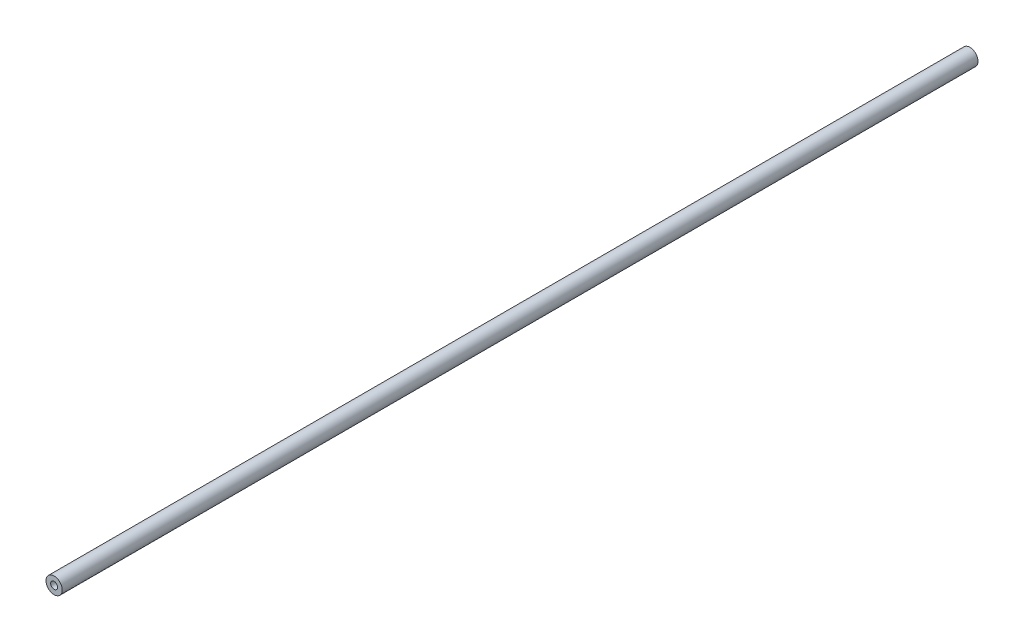
ISO-10303-21;
HEADER;
FILE_DESCRIPTION(('STEP AP214'),'2;1');
FILE_NAME('part.step','',(''),(''),'','','');
FILE_SCHEMA(('AUTOMOTIVE_DESIGN { 1 0 10303 214 1 1 1 1 }'));
ENDSEC;
DATA;
#1=APPLICATION_CONTEXT('core data for automotive mechanical design processes');
#2=APPLICATION_PROTOCOL_DEFINITION('international standard','automotive_design',2000,#1);
#3=PRODUCT_CONTEXT('',#1,'mechanical');
#4=PRODUCT('Part','Part','',(#3));
#5=PRODUCT_RELATED_PRODUCT_CATEGORY('part','',(#4));
#6=PRODUCT_DEFINITION_FORMATION('','',#4);
#7=PRODUCT_DEFINITION_CONTEXT('part definition',#1,'design');
#8=PRODUCT_DEFINITION('design','',#6,#7);
#9=PRODUCT_DEFINITION_SHAPE('','',#8);
#10=(LENGTH_UNIT() NAMED_UNIT(*) SI_UNIT(.MILLI.,.METRE.));
#11=(NAMED_UNIT(*) PLANE_ANGLE_UNIT() SI_UNIT($,.RADIAN.));
#12=(NAMED_UNIT(*) SI_UNIT($,.STERADIAN.) SOLID_ANGLE_UNIT());
#13=UNCERTAINTY_MEASURE_WITH_UNIT(LENGTH_MEASURE(1.E-05),#10,'distance_accuracy_value','');
#14=(GEOMETRIC_REPRESENTATION_CONTEXT(3) GLOBAL_UNCERTAINTY_ASSIGNED_CONTEXT((#13)) GLOBAL_UNIT_ASSIGNED_CONTEXT((#10,
#11,#12)) REPRESENTATION_CONTEXT('',''));
#15=CARTESIAN_POINT('',(0.,0.,0.));
#16=DIRECTION('',(0.,0.,1.));
#17=DIRECTION('',(1.,0.,0.));
#18=AXIS2_PLACEMENT_3D('',#15,#16,#17);
#19=CARTESIAN_POINT('',(0.,0.,268.2875));
#20=DIRECTION('',(0.,0.,-1.));
#21=DIRECTION('',(-1.,0.,0.));
#22=AXIS2_PLACEMENT_3D('',#19,#20,#21);
#23=CYLINDRICAL_SURFACE('',#22,4.7625);
#24=CARTESIAN_POINT('',(0.,0.,268.2875));
#25=DIRECTION('',(0.,0.,1.));
#26=DIRECTION('',(1.,0.,0.));
#27=AXIS2_PLACEMENT_3D('',#24,#25,#26);
#28=CIRCLE('',#27,4.7625);
#29=CARTESIAN_POINT('',(4.7625,0.,268.2875));
#30=VERTEX_POINT('',#29);
#31=EDGE_CURVE('E11',#30,#30,#28,.T.);
#32=ORIENTED_EDGE('',*,*,#31,.F.);
#33=EDGE_LOOP('',(#32));
#34=FACE_BOUND('',#33,.T.);
#35=CARTESIAN_POINT('',(0.,0.,-268.2875));
#36=DIRECTION('',(0.,0.,1.));
#37=DIRECTION('',(1.,0.,0.));
#38=AXIS2_PLACEMENT_3D('',#35,#36,#37);
#39=CIRCLE('',#38,4.7625);
#40=CARTESIAN_POINT('',(4.7625,0.,-268.2875));
#41=VERTEX_POINT('',#40);
#42=EDGE_CURVE('E51',#41,#41,#39,.T.);
#43=ORIENTED_EDGE('',*,*,#42,.T.);
#44=EDGE_LOOP('',(#43));
#45=FACE_BOUND('',#44,.T.);
#46=ADVANCED_FACE('F48',(#34,#45),#23,.T.);
#47=CARTESIAN_POINT('',(0.,0.,268.2875));
#48=DIRECTION('',(0.,0.,1.));
#49=DIRECTION('',(1.,0.,0.));
#50=AXIS2_PLACEMENT_3D('',#47,#48,#49);
#51=PLANE('',#50);
#52=CARTESIAN_POINT('',(0.,0.,268.2875));
#53=DIRECTION('',(0.,0.,1.));
#54=DIRECTION('',(1.,0.,0.));
#55=AXIS2_PLACEMENT_3D('',#52,#53,#54);
#56=CIRCLE('',#55,2.01929999999999);
#57=CARTESIAN_POINT('',(2.01929999999999,0.,268.2875));
#58=VERTEX_POINT('',#57);
#59=EDGE_CURVE('E74',#58,#58,#56,.T.);
#60=ORIENTED_EDGE('',*,*,#59,.F.);
#61=EDGE_LOOP('',(#60));
#62=FACE_BOUND('',#61,.T.);
#63=ORIENTED_EDGE('',*,*,#31,.T.);
#64=EDGE_LOOP('',(#63));
#65=FACE_BOUND('',#64,.T.);
#66=ADVANCED_FACE('F99',(#62,#65),#51,.T.);
#67=CARTESIAN_POINT('',(0.,0.,-268.2875));
#68=DIRECTION('',(0.,0.,1.));
#69=DIRECTION('',(1.,0.,0.));
#70=AXIS2_PLACEMENT_3D('',#67,#68,#69);
#71=PLANE('',#70);
#72=CARTESIAN_POINT('',(0.,0.,-268.2875));
#73=DIRECTION('',(0.,0.,-1.));
#74=DIRECTION('',(-1.,0.,0.));
#75=AXIS2_PLACEMENT_3D('',#72,#73,#74);
#76=CIRCLE('',#75,2.01929999999999);
#77=CARTESIAN_POINT('',(-2.01929999999999,0.,-268.2875));
#78=VERTEX_POINT('',#77);
#79=EDGE_CURVE('E73',#78,#78,#76,.T.);
#80=ORIENTED_EDGE('',*,*,#79,.F.);
#81=EDGE_LOOP('',(#80));
#82=FACE_BOUND('',#81,.T.);
#83=ORIENTED_EDGE('',*,*,#42,.F.);
#84=EDGE_LOOP('',(#83));
#85=FACE_BOUND('',#84,.T.);
#86=ADVANCED_FACE('F96',(#82,#85),#71,.F.);
#87=CARTESIAN_POINT('',(0.,0.,-256.25806));
#88=DIRECTION('',(0.,0.,-1.));
#89=DIRECTION('',(-1.,0.,0.));
#90=AXIS2_PLACEMENT_3D('',#87,#88,#89);
#91=CONICAL_SURFACE('',#90,2.01929999999999,1.02974425867666);
#92=CARTESIAN_POINT('',(0.,0.,-255.044742151998));
#93=VERTEX_POINT('',#92);
#94=VERTEX_LOOP('',#93);
#95=FACE_BOUND('',#94,.T.);
#96=CARTESIAN_POINT('',(0.,0.,-256.25806));
#97=DIRECTION('',(0.,0.,-1.));
#98=DIRECTION('',(-1.,0.,0.));
#99=AXIS2_PLACEMENT_3D('',#96,#97,#98);
#100=CIRCLE('',#99,2.01929999999999);
#101=CARTESIAN_POINT('',(-2.01929999999999,0.,-256.25806));
#102=VERTEX_POINT('',#101);
#103=EDGE_CURVE('E80',#102,#102,#100,.T.);
#104=ORIENTED_EDGE('',*,*,#103,.T.);
#105=EDGE_LOOP('',(#104));
#106=FACE_BOUND('',#105,.T.);
#107=ADVANCED_FACE('F98',(#95,#106),#91,.F.);
#108=CARTESIAN_POINT('',(0.,0.,-268.2875));
#109=DIRECTION('',(0.,0.,-1.));
#110=DIRECTION('',(-1.,0.,0.));
#111=AXIS2_PLACEMENT_3D('',#108,#109,#110);
#112=CYLINDRICAL_SURFACE('',#111,2.01929999999999);
#113=ORIENTED_EDGE('',*,*,#103,.F.);
#114=EDGE_LOOP('',(#113));
#115=FACE_BOUND('',#114,.T.);
#116=ORIENTED_EDGE('',*,*,#79,.T.);
#117=EDGE_LOOP('',(#116));
#118=FACE_BOUND('',#117,.T.);
#119=ADVANCED_FACE('F66',(#115,#118),#112,.F.);
#120=CARTESIAN_POINT('',(0.,0.,256.25806));
#121=DIRECTION('',(0.,0.,1.));
#122=DIRECTION('',(1.,0.,0.));
#123=AXIS2_PLACEMENT_3D('',#120,#121,#122);
#124=CONICAL_SURFACE('',#123,2.01929999999999,1.02974425867666);
#125=CARTESIAN_POINT('',(0.,0.,255.044742151998));
#126=VERTEX_POINT('',#125);
#127=VERTEX_LOOP('',#126);
#128=FACE_BOUND('',#127,.T.);
#129=CARTESIAN_POINT('',(0.,0.,256.25806));
#130=DIRECTION('',(0.,0.,1.));
#131=DIRECTION('',(1.,0.,0.));
#132=AXIS2_PLACEMENT_3D('',#129,#130,#131);
#133=CIRCLE('',#132,2.01929999999999);
#134=CARTESIAN_POINT('',(2.01929999999999,0.,256.25806));
#135=VERTEX_POINT('',#134);
#136=EDGE_CURVE('E70',#135,#135,#133,.T.);
#137=ORIENTED_EDGE('',*,*,#136,.T.);
#138=EDGE_LOOP('',(#137));
#139=FACE_BOUND('',#138,.T.);
#140=ADVANCED_FACE('F62',(#128,#139),#124,.F.);
#141=CARTESIAN_POINT('',(0.,0.,268.2875));
#142=DIRECTION('',(0.,0.,1.));
#143=DIRECTION('',(1.,0.,0.));
#144=AXIS2_PLACEMENT_3D('',#141,#142,#143);
#145=CYLINDRICAL_SURFACE('',#144,2.01929999999999);
#146=ORIENTED_EDGE('',*,*,#136,.F.);
#147=EDGE_LOOP('',(#146));
#148=FACE_BOUND('',#147,.T.);
#149=ORIENTED_EDGE('',*,*,#59,.T.);
#150=EDGE_LOOP('',(#149));
#151=FACE_BOUND('',#150,.T.);
#152=ADVANCED_FACE('F65',(#148,#151),#145,.F.);
#153=CLOSED_SHELL('',(#46,#66,#86,#107,#119,#140,#152));
#154=MANIFOLD_SOLID_BREP('B2',#153);
#155=ADVANCED_BREP_SHAPE_REPRESENTATION('',(#18,#154),#14);
#156=SHAPE_DEFINITION_REPRESENTATION(#9,#155);
ENDSEC;
END-ISO-10303-21;
